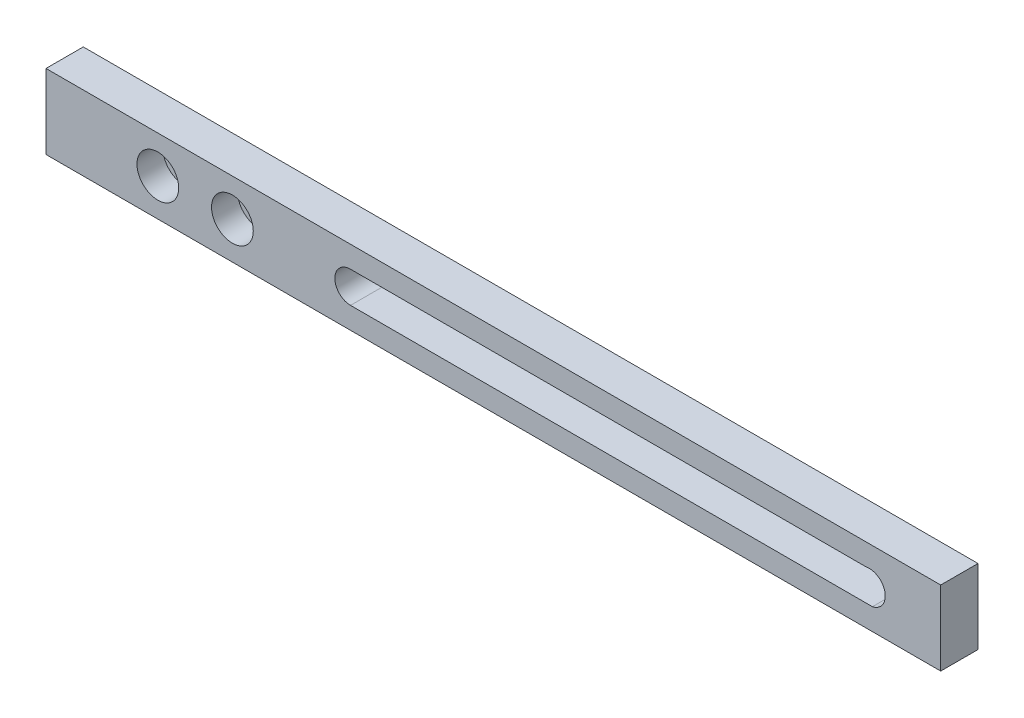
ISO-10303-21;
HEADER;
FILE_DESCRIPTION(('STEP AP214'),'2;1');
FILE_NAME('part.step','',(''),(''),'','','');
FILE_SCHEMA(('AUTOMOTIVE_DESIGN { 1 0 10303 214 1 1 1 1 }'));
ENDSEC;
DATA;
#1=APPLICATION_CONTEXT('core data for automotive mechanical design processes');
#2=APPLICATION_PROTOCOL_DEFINITION('international standard','automotive_design',2000,#1);
#3=PRODUCT_CONTEXT('',#1,'mechanical');
#4=PRODUCT('Part','Part','',(#3));
#5=PRODUCT_RELATED_PRODUCT_CATEGORY('part','',(#4));
#6=PRODUCT_DEFINITION_FORMATION('','',#4);
#7=PRODUCT_DEFINITION_CONTEXT('part definition',#1,'design');
#8=PRODUCT_DEFINITION('design','',#6,#7);
#9=PRODUCT_DEFINITION_SHAPE('','',#8);
#10=(LENGTH_UNIT() NAMED_UNIT(*) SI_UNIT(.MILLI.,.METRE.));
#11=(NAMED_UNIT(*) PLANE_ANGLE_UNIT() SI_UNIT($,.RADIAN.));
#12=(NAMED_UNIT(*) SI_UNIT($,.STERADIAN.) SOLID_ANGLE_UNIT());
#13=UNCERTAINTY_MEASURE_WITH_UNIT(LENGTH_MEASURE(1.E-05),#10,'distance_accuracy_value','');
#14=(GEOMETRIC_REPRESENTATION_CONTEXT(3) GLOBAL_UNCERTAINTY_ASSIGNED_CONTEXT((#13)) GLOBAL_UNIT_ASSIGNED_CONTEXT((#10,
#11,#12)) REPRESENTATION_CONTEXT('',''));
#15=CARTESIAN_POINT('',(0.,0.,0.));
#16=DIRECTION('',(0.,0.,1.));
#17=DIRECTION('',(1.,0.,0.));
#18=AXIS2_PLACEMENT_3D('',#15,#16,#17);
#19=CARTESIAN_POINT('',(-35.,0.,0.));
#20=DIRECTION('',(0.,0.,1.));
#21=DIRECTION('',(1.,0.,0.));
#22=AXIS2_PLACEMENT_3D('',#19,#20,#21);
#23=CYLINDRICAL_SURFACE('',#22,1.25);
#24=CARTESIAN_POINT('',(-35.,0.,0.));
#25=DIRECTION('',(0.,0.,1.));
#26=DIRECTION('',(1.,0.,0.));
#27=AXIS2_PLACEMENT_3D('',#24,#25,#26);
#28=CIRCLE('',#27,1.25);
#29=CARTESIAN_POINT('',(-33.75,0.,0.));
#30=VERTEX_POINT('',#29);
#31=EDGE_CURVE('E165',#30,#30,#28,.T.);
#32=ORIENTED_EDGE('',*,*,#31,.F.);
#33=EDGE_LOOP('',(#32));
#34=FACE_BOUND('',#33,.T.);
#35=CARTESIAN_POINT('',(-35.,0.,1.5));
#36=DIRECTION('',(0.,0.,1.));
#37=DIRECTION('',(1.,0.,0.));
#38=AXIS2_PLACEMENT_3D('',#35,#36,#37);
#39=CIRCLE('',#38,1.25);
#40=CARTESIAN_POINT('',(-33.75,0.,1.5));
#41=VERTEX_POINT('',#40);
#42=EDGE_CURVE('E36',#41,#41,#39,.F.);
#43=ORIENTED_EDGE('',*,*,#42,.F.);
#44=EDGE_LOOP('',(#43));
#45=FACE_BOUND('',#44,.T.);
#46=ADVANCED_FACE('F32',(#34,#45),#23,.F.);
#47=CARTESIAN_POINT('',(-45.,0.,0.));
#48=DIRECTION('',(0.,0.,1.));
#49=DIRECTION('',(1.,0.,0.));
#50=AXIS2_PLACEMENT_3D('',#47,#48,#49);
#51=CYLINDRICAL_SURFACE('',#50,1.25);
#52=CARTESIAN_POINT('',(-45.,0.,0.));
#53=DIRECTION('',(0.,0.,1.));
#54=DIRECTION('',(1.,0.,0.));
#55=AXIS2_PLACEMENT_3D('',#52,#53,#54);
#56=CIRCLE('',#55,1.25);
#57=CARTESIAN_POINT('',(-43.75,0.,0.));
#58=VERTEX_POINT('',#57);
#59=EDGE_CURVE('E123',#58,#58,#56,.T.);
#60=ORIENTED_EDGE('',*,*,#59,.F.);
#61=EDGE_LOOP('',(#60));
#62=FACE_BOUND('',#61,.T.);
#63=CARTESIAN_POINT('',(-45.,0.,1.5));
#64=DIRECTION('',(0.,0.,1.));
#65=DIRECTION('',(1.,0.,0.));
#66=AXIS2_PLACEMENT_3D('',#63,#64,#65);
#67=CIRCLE('',#66,1.25);
#68=CARTESIAN_POINT('',(-43.75,0.,1.5));
#69=VERTEX_POINT('',#68);
#70=EDGE_CURVE('E163',#69,#69,#67,.F.);
#71=ORIENTED_EDGE('',*,*,#70,.F.);
#72=EDGE_LOOP('',(#71));
#73=FACE_BOUND('',#72,.T.);
#74=ADVANCED_FACE('F191',(#62,#73),#51,.F.);
#75=CARTESIAN_POINT('',(60.,5.,5.));
#76=DIRECTION('',(-1.,0.,0.));
#77=DIRECTION('',(0.,0.,1.));
#78=AXIS2_PLACEMENT_3D('',#75,#76,#77);
#79=PLANE('',#78);
#80=DIRECTION('',(0.,1.,0.));
#81=VECTOR('',#80,1.);
#82=CARTESIAN_POINT('',(60.,5.,0.));
#83=LINE('',#82,#81);
#84=CARTESIAN_POINT('',(60.,-5.,0.));
#85=VERTEX_POINT('',#84);
#86=CARTESIAN_POINT('',(60.,5.,0.));
#87=VERTEX_POINT('',#86);
#88=EDGE_CURVE('E135',#85,#87,#83,.T.);
#89=ORIENTED_EDGE('',*,*,#88,.T.);
#90=DIRECTION('',(0.,0.,-1.));
#91=VECTOR('',#90,1.);
#92=CARTESIAN_POINT('',(60.,5.,5.));
#93=LINE('',#92,#91);
#94=CARTESIAN_POINT('',(60.,5.,5.));
#95=VERTEX_POINT('',#94);
#96=EDGE_CURVE('E11',#95,#87,#93,.T.);
#97=ORIENTED_EDGE('',*,*,#96,.F.);
#98=DIRECTION('',(0.,1.,0.));
#99=VECTOR('',#98,1.);
#100=CARTESIAN_POINT('',(60.,5.,5.));
#101=LINE('',#100,#99);
#102=CARTESIAN_POINT('',(60.,-5.,5.));
#103=VERTEX_POINT('',#102);
#104=EDGE_CURVE('E139',#103,#95,#101,.T.);
#105=ORIENTED_EDGE('',*,*,#104,.F.);
#106=DIRECTION('',(0.,0.,-1.));
#107=VECTOR('',#106,1.);
#108=CARTESIAN_POINT('',(60.,-5.,5.));
#109=LINE('',#108,#107);
#110=EDGE_CURVE('E149',#103,#85,#109,.T.);
#111=ORIENTED_EDGE('',*,*,#110,.T.);
#112=EDGE_LOOP('',(#89,#97,#105,#111));
#113=FACE_BOUND('',#112,.T.);
#114=ADVANCED_FACE('F34',(#113),#79,.F.);
#115=CARTESIAN_POINT('',(-60.,5.,5.));
#116=DIRECTION('',(0.,-1.,0.));
#117=DIRECTION('',(0.,0.,-1.));
#118=AXIS2_PLACEMENT_3D('',#115,#116,#117);
#119=PLANE('',#118);
#120=DIRECTION('',(-1.,0.,0.));
#121=VECTOR('',#120,1.);
#122=CARTESIAN_POINT('',(-60.,5.,0.));
#123=LINE('',#122,#121);
#124=CARTESIAN_POINT('',(-60.,5.,0.));
#125=VERTEX_POINT('',#124);
#126=EDGE_CURVE('E152',#87,#125,#123,.T.);
#127=ORIENTED_EDGE('',*,*,#126,.T.);
#128=DIRECTION('',(0.,0.,-1.));
#129=VECTOR('',#128,1.);
#130=CARTESIAN_POINT('',(-60.,5.,5.));
#131=LINE('',#130,#129);
#132=CARTESIAN_POINT('',(-60.,5.,5.));
#133=VERTEX_POINT('',#132);
#134=EDGE_CURVE('E41',#133,#125,#131,.T.);
#135=ORIENTED_EDGE('',*,*,#134,.F.);
#136=DIRECTION('',(-1.,0.,0.));
#137=VECTOR('',#136,1.);
#138=CARTESIAN_POINT('',(-60.,5.,5.));
#139=LINE('',#138,#137);
#140=EDGE_CURVE('E142',#95,#133,#139,.T.);
#141=ORIENTED_EDGE('',*,*,#140,.F.);
#142=ORIENTED_EDGE('',*,*,#96,.T.);
#143=EDGE_LOOP('',(#127,#135,#141,#142));
#144=FACE_BOUND('',#143,.T.);
#145=ADVANCED_FACE('F229',(#144),#119,.F.);
#146=CARTESIAN_POINT('',(-60.,5.,5.));
#147=DIRECTION('',(1.,0.,0.));
#148=DIRECTION('',(0.,0.,-1.));
#149=AXIS2_PLACEMENT_3D('',#146,#147,#148);
#150=PLANE('',#149);
#151=DIRECTION('',(0.,-1.,0.));
#152=VECTOR('',#151,1.);
#153=CARTESIAN_POINT('',(-60.,5.,0.));
#154=LINE('',#153,#152);
#155=CARTESIAN_POINT('',(-60.,-5.,0.));
#156=VERTEX_POINT('',#155);
#157=EDGE_CURVE('E154',#125,#156,#154,.T.);
#158=ORIENTED_EDGE('',*,*,#157,.T.);
#159=DIRECTION('',(0.,0.,-1.));
#160=VECTOR('',#159,1.);
#161=CARTESIAN_POINT('',(-60.,-5.,5.));
#162=LINE('',#161,#160);
#163=CARTESIAN_POINT('',(-60.,-5.,5.));
#164=VERTEX_POINT('',#163);
#165=EDGE_CURVE('E159',#164,#156,#162,.T.);
#166=ORIENTED_EDGE('',*,*,#165,.F.);
#167=DIRECTION('',(0.,-1.,0.));
#168=VECTOR('',#167,1.);
#169=CARTESIAN_POINT('',(-60.,5.,5.));
#170=LINE('',#169,#168);
#171=EDGE_CURVE('E145',#133,#164,#170,.T.);
#172=ORIENTED_EDGE('',*,*,#171,.F.);
#173=ORIENTED_EDGE('',*,*,#134,.T.);
#174=EDGE_LOOP('',(#158,#166,#172,#173));
#175=FACE_BOUND('',#174,.T.);
#176=ADVANCED_FACE('F226',(#175),#150,.F.);
#177=CARTESIAN_POINT('',(-60.,-5.,5.));
#178=DIRECTION('',(0.,1.,0.));
#179=DIRECTION('',(0.,0.,1.));
#180=AXIS2_PLACEMENT_3D('',#177,#178,#179);
#181=PLANE('',#180);
#182=DIRECTION('',(1.,0.,0.));
#183=VECTOR('',#182,1.);
#184=CARTESIAN_POINT('',(-60.,-5.,0.));
#185=LINE('',#184,#183);
#186=EDGE_CURVE('E143',#156,#85,#185,.T.);
#187=ORIENTED_EDGE('',*,*,#186,.T.);
#188=ORIENTED_EDGE('',*,*,#110,.F.);
#189=DIRECTION('',(1.,0.,0.));
#190=VECTOR('',#189,1.);
#191=CARTESIAN_POINT('',(-60.,-5.,5.));
#192=LINE('',#191,#190);
#193=EDGE_CURVE('E147',#164,#103,#192,.T.);
#194=ORIENTED_EDGE('',*,*,#193,.F.);
#195=ORIENTED_EDGE('',*,*,#165,.T.);
#196=EDGE_LOOP('',(#187,#188,#194,#195));
#197=FACE_BOUND('',#196,.T.);
#198=ADVANCED_FACE('F219',(#197),#181,.F.);
#199=CARTESIAN_POINT('',(0.,0.,5.));
#200=DIRECTION('',(0.,0.,1.));
#201=DIRECTION('',(1.,0.,0.));
#202=AXIS2_PLACEMENT_3D('',#199,#200,#201);
#203=PLANE('',#202);
#204=CARTESIAN_POINT('',(-35.,0.,5.));
#205=DIRECTION('',(0.,0.,1.));
#206=DIRECTION('',(1.,0.,0.));
#207=AXIS2_PLACEMENT_3D('',#204,#205,#206);
#208=CIRCLE('',#207,2.8);
#209=CARTESIAN_POINT('',(-32.2,0.,5.));
#210=VERTEX_POINT('',#209);
#211=EDGE_CURVE('E178',#210,#210,#208,.T.);
#212=ORIENTED_EDGE('',*,*,#211,.F.);
#213=EDGE_LOOP('',(#212));
#214=FACE_BOUND('',#213,.T.);
#215=CARTESIAN_POINT('',(-45.,0.,5.));
#216=DIRECTION('',(0.,0.,1.));
#217=DIRECTION('',(1.,0.,0.));
#218=AXIS2_PLACEMENT_3D('',#215,#216,#217);
#219=CIRCLE('',#218,2.8);
#220=CARTESIAN_POINT('',(-42.2,0.,5.));
#221=VERTEX_POINT('',#220);
#222=EDGE_CURVE('E171',#221,#221,#219,.T.);
#223=ORIENTED_EDGE('',*,*,#222,.F.);
#224=EDGE_LOOP('',(#223));
#225=FACE_BOUND('',#224,.T.);
#226=CARTESIAN_POINT('',(50.4198233463487,0.,5.));
#227=DIRECTION('',(0.,0.,1.));
#228=DIRECTION('',(-1.,0.,0.));
#229=AXIS2_PLACEMENT_3D('',#226,#227,#228);
#230=CIRCLE('',#229,2.14155355808333);
#231=CARTESIAN_POINT('',(50.8396466926973,-2.1,5.));
#232=VERTEX_POINT('',#231);
#233=CARTESIAN_POINT('',(50.,2.1,5.));
#234=VERTEX_POINT('',#233);
#235=EDGE_CURVE('E49',#232,#234,#230,.T.);
#236=ORIENTED_EDGE('',*,*,#235,.F.);
#237=DIRECTION('',(1.,0.,0.));
#238=VECTOR('',#237,1.);
#239=CARTESIAN_POINT('',(-19.1603533073027,-2.1,5.));
#240=LINE('',#239,#238);
#241=CARTESIAN_POINT('',(-19.1603533073027,-2.1,5.));
#242=VERTEX_POINT('',#241);
#243=EDGE_CURVE('E117',#242,#232,#240,.T.);
#244=ORIENTED_EDGE('',*,*,#243,.F.);
#245=CARTESIAN_POINT('',(-19.1603533073027,0.,5.));
#246=DIRECTION('',(0.,0.,1.));
#247=DIRECTION('',(1.,0.,0.));
#248=AXIS2_PLACEMENT_3D('',#245,#246,#247);
#249=CIRCLE('',#248,2.1);
#250=CARTESIAN_POINT('',(-19.1603533073027,2.1,5.));
#251=VERTEX_POINT('',#250);
#252=EDGE_CURVE('E120',#251,#242,#249,.T.);
#253=ORIENTED_EDGE('',*,*,#252,.F.);
#254=DIRECTION('',(-1.,0.,0.));
#255=VECTOR('',#254,1.);
#256=CARTESIAN_POINT('',(-19.1603533073027,2.1,5.));
#257=LINE('',#256,#255);
#258=EDGE_CURVE('E129',#234,#251,#257,.T.);
#259=ORIENTED_EDGE('',*,*,#258,.F.);
#260=EDGE_LOOP('',(#236,#244,#253,#259));
#261=FACE_BOUND('',#260,.T.);
#262=ORIENTED_EDGE('',*,*,#104,.T.);
#263=ORIENTED_EDGE('',*,*,#140,.T.);
#264=ORIENTED_EDGE('',*,*,#171,.T.);
#265=ORIENTED_EDGE('',*,*,#193,.T.);
#266=EDGE_LOOP('',(#262,#263,#264,#265));
#267=FACE_BOUND('',#266,.T.);
#268=ADVANCED_FACE('F216',(#214,#225,#261,#267),#203,.T.);
#269=CARTESIAN_POINT('',(0.,0.,0.));
#270=DIRECTION('',(0.,0.,1.));
#271=DIRECTION('',(1.,0.,0.));
#272=AXIS2_PLACEMENT_3D('',#269,#270,#271);
#273=PLANE('',#272);
#274=ORIENTED_EDGE('',*,*,#31,.T.);
#275=EDGE_LOOP('',(#274));
#276=FACE_BOUND('',#275,.T.);
#277=ORIENTED_EDGE('',*,*,#59,.T.);
#278=EDGE_LOOP('',(#277));
#279=FACE_BOUND('',#278,.T.);
#280=DIRECTION('',(1.,0.,0.));
#281=VECTOR('',#280,1.);
#282=CARTESIAN_POINT('',(-19.1603533073027,-2.1,0.));
#283=LINE('',#282,#281);
#284=CARTESIAN_POINT('',(-19.1603533073027,-2.1,0.));
#285=VERTEX_POINT('',#284);
#286=CARTESIAN_POINT('',(50.8396466926973,-2.1,0.));
#287=VERTEX_POINT('',#286);
#288=EDGE_CURVE('E107',#285,#287,#283,.T.);
#289=ORIENTED_EDGE('',*,*,#288,.T.);
#290=CARTESIAN_POINT('',(50.4198233463487,0.,0.));
#291=DIRECTION('',(0.,0.,1.));
#292=DIRECTION('',(-1.,0.,0.));
#293=AXIS2_PLACEMENT_3D('',#290,#291,#292);
#294=CIRCLE('',#293,2.14155355808333);
#295=CARTESIAN_POINT('',(50.,2.1,0.));
#296=VERTEX_POINT('',#295);
#297=EDGE_CURVE('E101',#287,#296,#294,.T.);
#298=ORIENTED_EDGE('',*,*,#297,.T.);
#299=DIRECTION('',(-1.,0.,0.));
#300=VECTOR('',#299,1.);
#301=CARTESIAN_POINT('',(-19.1603533073027,2.1,0.));
#302=LINE('',#301,#300);
#303=CARTESIAN_POINT('',(-19.1603533073027,2.1,0.));
#304=VERTEX_POINT('',#303);
#305=EDGE_CURVE('E110',#296,#304,#302,.T.);
#306=ORIENTED_EDGE('',*,*,#305,.T.);
#307=CARTESIAN_POINT('',(-19.1603533073027,0.,0.));
#308=DIRECTION('',(0.,0.,1.));
#309=DIRECTION('',(1.,0.,0.));
#310=AXIS2_PLACEMENT_3D('',#307,#308,#309);
#311=CIRCLE('',#310,2.1);
#312=EDGE_CURVE('E57',#304,#285,#311,.T.);
#313=ORIENTED_EDGE('',*,*,#312,.T.);
#314=EDGE_LOOP('',(#289,#298,#306,#313));
#315=FACE_BOUND('',#314,.T.);
#316=ORIENTED_EDGE('',*,*,#88,.F.);
#317=ORIENTED_EDGE('',*,*,#186,.F.);
#318=ORIENTED_EDGE('',*,*,#157,.F.);
#319=ORIENTED_EDGE('',*,*,#126,.F.);
#320=EDGE_LOOP('',(#316,#317,#318,#319));
#321=FACE_BOUND('',#320,.T.);
#322=ADVANCED_FACE('F114',(#276,#279,#315,#321),#273,.F.);
#323=CARTESIAN_POINT('',(50.4198233463487,0.,0.));
#324=DIRECTION('',(0.,0.,1.));
#325=DIRECTION('',(1.,0.,0.));
#326=AXIS2_PLACEMENT_3D('',#323,#324,#325);
#327=CYLINDRICAL_SURFACE('',#326,2.14155355808333);
#328=ORIENTED_EDGE('',*,*,#235,.T.);
#329=DIRECTION('',(0.,0.,1.));
#330=VECTOR('',#329,1.);
#331=CARTESIAN_POINT('',(50.,2.1,0.));
#332=LINE('',#331,#330);
#333=EDGE_CURVE('E97',#296,#234,#332,.T.);
#334=ORIENTED_EDGE('',*,*,#333,.F.);
#335=ORIENTED_EDGE('',*,*,#297,.F.);
#336=DIRECTION('',(0.,0.,1.));
#337=VECTOR('',#336,1.);
#338=CARTESIAN_POINT('',(50.8396466926973,-2.1,0.));
#339=LINE('',#338,#337);
#340=EDGE_CURVE('E133',#287,#232,#339,.T.);
#341=ORIENTED_EDGE('',*,*,#340,.T.);
#342=EDGE_LOOP('',(#328,#334,#335,#341));
#343=FACE_BOUND('',#342,.T.);
#344=ADVANCED_FACE('F99',(#343),#327,.F.);
#345=CARTESIAN_POINT('',(-19.1603533073027,-2.1,0.));
#346=DIRECTION('',(0.,-1.,0.));
#347=DIRECTION('',(0.,0.,-1.));
#348=AXIS2_PLACEMENT_3D('',#345,#346,#347);
#349=PLANE('',#348);
#350=ORIENTED_EDGE('',*,*,#243,.T.);
#351=ORIENTED_EDGE('',*,*,#340,.F.);
#352=ORIENTED_EDGE('',*,*,#288,.F.);
#353=DIRECTION('',(0.,0.,1.));
#354=VECTOR('',#353,1.);
#355=CARTESIAN_POINT('',(-19.1603533073027,-2.1,0.));
#356=LINE('',#355,#354);
#357=EDGE_CURVE('E136',#285,#242,#356,.T.);
#358=ORIENTED_EDGE('',*,*,#357,.T.);
#359=EDGE_LOOP('',(#350,#351,#352,#358));
#360=FACE_BOUND('',#359,.T.);
#361=ADVANCED_FACE('F204',(#360),#349,.F.);
#362=CARTESIAN_POINT('',(-19.1603533073027,0.,0.));
#363=DIRECTION('',(0.,0.,1.));
#364=DIRECTION('',(1.,0.,0.));
#365=AXIS2_PLACEMENT_3D('',#362,#363,#364);
#366=CYLINDRICAL_SURFACE('',#365,2.1);
#367=ORIENTED_EDGE('',*,*,#252,.T.);
#368=ORIENTED_EDGE('',*,*,#357,.F.);
#369=ORIENTED_EDGE('',*,*,#312,.F.);
#370=DIRECTION('',(0.,0.,1.));
#371=VECTOR('',#370,1.);
#372=CARTESIAN_POINT('',(-19.1603533073027,2.1,0.));
#373=LINE('',#372,#371);
#374=EDGE_CURVE('E106',#304,#251,#373,.T.);
#375=ORIENTED_EDGE('',*,*,#374,.T.);
#376=EDGE_LOOP('',(#367,#368,#369,#375));
#377=FACE_BOUND('',#376,.T.);
#378=ADVANCED_FACE('F207',(#377),#366,.F.);
#379=CARTESIAN_POINT('',(-19.1603533073027,2.1,0.));
#380=DIRECTION('',(0.,1.,0.));
#381=DIRECTION('',(0.,0.,1.));
#382=AXIS2_PLACEMENT_3D('',#379,#380,#381);
#383=PLANE('',#382);
#384=ORIENTED_EDGE('',*,*,#258,.T.);
#385=ORIENTED_EDGE('',*,*,#374,.F.);
#386=ORIENTED_EDGE('',*,*,#305,.F.);
#387=ORIENTED_EDGE('',*,*,#333,.T.);
#388=EDGE_LOOP('',(#384,#385,#386,#387));
#389=FACE_BOUND('',#388,.T.);
#390=ADVANCED_FACE('F111',(#389),#383,.F.);
#391=CARTESIAN_POINT('',(-45.,0.,1.5));
#392=DIRECTION('',(0.,0.,1.));
#393=DIRECTION('',(1.,0.,0.));
#394=AXIS2_PLACEMENT_3D('',#391,#392,#393);
#395=PLANE('',#394);
#396=CARTESIAN_POINT('',(-45.,0.,1.5));
#397=DIRECTION('',(0.,0.,1.));
#398=DIRECTION('',(1.,0.,0.));
#399=AXIS2_PLACEMENT_3D('',#396,#397,#398);
#400=CIRCLE('',#399,2.8);
#401=CARTESIAN_POINT('',(-42.2,0.,1.5));
#402=VERTEX_POINT('',#401);
#403=EDGE_CURVE('E166',#402,#402,#400,.T.);
#404=ORIENTED_EDGE('',*,*,#403,.T.);
#405=EDGE_LOOP('',(#404));
#406=FACE_BOUND('',#405,.T.);
#407=ORIENTED_EDGE('',*,*,#70,.T.);
#408=EDGE_LOOP('',(#407));
#409=FACE_BOUND('',#408,.T.);
#410=ADVANCED_FACE('F213',(#406,#409),#395,.T.);
#411=CARTESIAN_POINT('',(-45.,0.,1.5));
#412=DIRECTION('',(0.,0.,1.));
#413=DIRECTION('',(1.,0.,0.));
#414=AXIS2_PLACEMENT_3D('',#411,#412,#413);
#415=CYLINDRICAL_SURFACE('',#414,2.8);
#416=ORIENTED_EDGE('',*,*,#403,.F.);
#417=EDGE_LOOP('',(#416));
#418=FACE_BOUND('',#417,.T.);
#419=ORIENTED_EDGE('',*,*,#222,.T.);
#420=EDGE_LOOP('',(#419));
#421=FACE_BOUND('',#420,.T.);
#422=ADVANCED_FACE('F201',(#418,#421),#415,.F.);
#423=CARTESIAN_POINT('',(-35.,0.,1.5));
#424=DIRECTION('',(0.,0.,1.));
#425=DIRECTION('',(1.,0.,0.));
#426=AXIS2_PLACEMENT_3D('',#423,#424,#425);
#427=PLANE('',#426);
#428=CARTESIAN_POINT('',(-35.,0.,1.5));
#429=DIRECTION('',(0.,0.,1.));
#430=DIRECTION('',(1.,0.,0.));
#431=AXIS2_PLACEMENT_3D('',#428,#429,#430);
#432=CIRCLE('',#431,2.8);
#433=CARTESIAN_POINT('',(-32.2,0.,1.5));
#434=VERTEX_POINT('',#433);
#435=EDGE_CURVE('E181',#434,#434,#432,.T.);
#436=ORIENTED_EDGE('',*,*,#435,.T.);
#437=EDGE_LOOP('',(#436));
#438=FACE_BOUND('',#437,.T.);
#439=ORIENTED_EDGE('',*,*,#42,.T.);
#440=EDGE_LOOP('',(#439));
#441=FACE_BOUND('',#440,.T.);
#442=ADVANCED_FACE('F188',(#438,#441),#427,.T.);
#443=CARTESIAN_POINT('',(-35.,0.,1.5));
#444=DIRECTION('',(0.,0.,1.));
#445=DIRECTION('',(1.,0.,0.));
#446=AXIS2_PLACEMENT_3D('',#443,#444,#445);
#447=CYLINDRICAL_SURFACE('',#446,2.8);
#448=ORIENTED_EDGE('',*,*,#435,.F.);
#449=EDGE_LOOP('',(#448));
#450=FACE_BOUND('',#449,.T.);
#451=ORIENTED_EDGE('',*,*,#211,.T.);
#452=EDGE_LOOP('',(#451));
#453=FACE_BOUND('',#452,.T.);
#454=ADVANCED_FACE('F290',(#450,#453),#447,.F.);
#455=CLOSED_SHELL('',(#46,#74,#114,#145,#176,#198,#268,#322,#344,#361,#378,#390,#410,#422,#442,#454));
#456=MANIFOLD_SOLID_BREP('B2',#455);
#457=ADVANCED_BREP_SHAPE_REPRESENTATION('',(#18,#456),#14);
#458=SHAPE_DEFINITION_REPRESENTATION(#9,#457);
ENDSEC;
END-ISO-10303-21;
